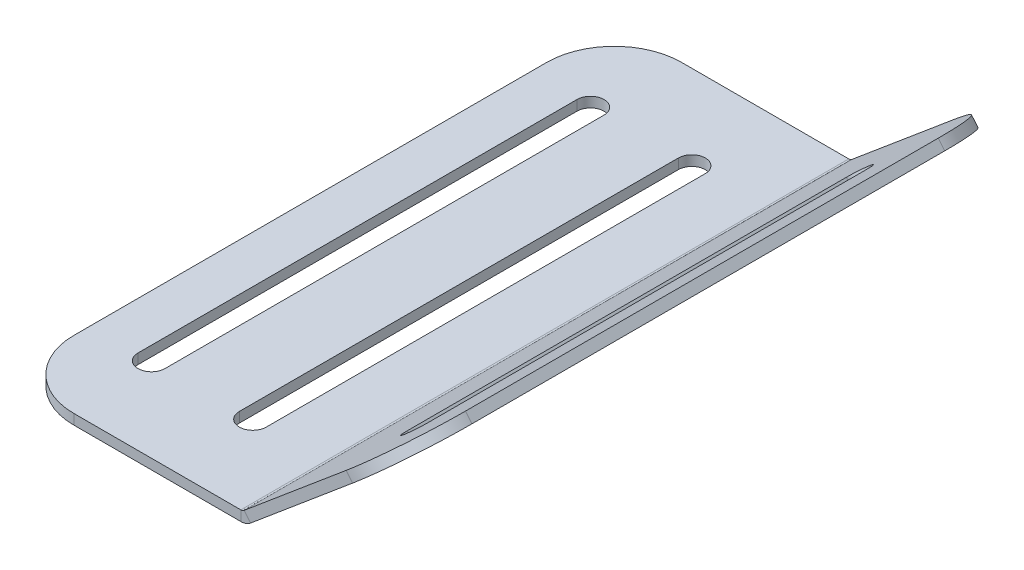
ISO-10303-21;
HEADER;
FILE_DESCRIPTION(('STEP AP214'),'2;1');
FILE_NAME('part.step','',(''),(''),'','','');
FILE_SCHEMA(('AUTOMOTIVE_DESIGN { 1 0 10303 214 1 1 1 1 }'));
ENDSEC;
DATA;
#1=APPLICATION_CONTEXT('core data for automotive mechanical design processes');
#2=APPLICATION_PROTOCOL_DEFINITION('international standard','automotive_design',2000,#1);
#3=PRODUCT_CONTEXT('',#1,'mechanical');
#4=PRODUCT('Part','Part','',(#3));
#5=PRODUCT_RELATED_PRODUCT_CATEGORY('part','',(#4));
#6=PRODUCT_DEFINITION_FORMATION('','',#4);
#7=PRODUCT_DEFINITION_CONTEXT('part definition',#1,'design');
#8=PRODUCT_DEFINITION('design','',#6,#7);
#9=PRODUCT_DEFINITION_SHAPE('','',#8);
#10=(LENGTH_UNIT() NAMED_UNIT(*) SI_UNIT(.MILLI.,.METRE.));
#11=(NAMED_UNIT(*) PLANE_ANGLE_UNIT() SI_UNIT($,.RADIAN.));
#12=(NAMED_UNIT(*) SI_UNIT($,.STERADIAN.) SOLID_ANGLE_UNIT());
#13=UNCERTAINTY_MEASURE_WITH_UNIT(LENGTH_MEASURE(1.E-05),#10,'distance_accuracy_value','');
#14=(GEOMETRIC_REPRESENTATION_CONTEXT(3) GLOBAL_UNCERTAINTY_ASSIGNED_CONTEXT((#13)) GLOBAL_UNIT_ASSIGNED_CONTEXT((#10,
#11,#12)) REPRESENTATION_CONTEXT('',''));
#15=CARTESIAN_POINT('',(0.,0.,0.));
#16=DIRECTION('',(0.,0.,1.));
#17=DIRECTION('',(1.,0.,0.));
#18=AXIS2_PLACEMENT_3D('',#15,#16,#17);
#19=CARTESIAN_POINT('',(35.2053768787346,0.17233166319856,90.));
#20=DIRECTION('',(0.,0.,1.));
#21=DIRECTION('',(1.,0.,0.));
#22=AXIS2_PLACEMENT_3D('',#19,#20,#21);
#23=PLANE('',#22);
#24=DIRECTION('',(0.642787609686539,-0.766044443118978,0.));
#25=VECTOR('',#24,1.);
#26=CARTESIAN_POINT('',(35.2053768787346,0.17233166319856,90.));
#27=LINE('',#26,#25);
#28=CARTESIAN_POINT('',(35.2053768787346,0.17233166319856,90.));
#29=VERTEX_POINT('',#28);
#30=CARTESIAN_POINT('',(36.1695582932644,-0.976735001479905,90.));
#31=VERTEX_POINT('',#30);
#32=EDGE_CURVE('E401',#29,#31,#27,.T.);
#33=ORIENTED_EDGE('',*,*,#32,.F.);
#34=CARTESIAN_POINT('',(34.7318995254395,0.7366,90.));
#35=DIRECTION('',(0.,0.,-1.));
#36=DIRECTION('',(-1.,0.,0.));
#37=AXIS2_PLACEMENT_3D('',#34,#35,#36);
#38=CIRCLE('',#37,0.7366);
#39=CARTESIAN_POINT('',(34.7318995254395,0.,90.));
#40=VERTEX_POINT('',#39);
#41=EDGE_CURVE('E326',#40,#29,#38,.F.);
#42=ORIENTED_EDGE('',*,*,#41,.F.);
#43=DIRECTION('',(0.,1.,0.));
#44=VECTOR('',#43,1.);
#45=CARTESIAN_POINT('',(34.7318995254395,-1.5,90.));
#46=LINE('',#45,#44);
#47=CARTESIAN_POINT('',(34.7318995254395,-1.5,90.));
#48=VERTEX_POINT('',#47);
#49=EDGE_CURVE('E397',#48,#40,#46,.T.);
#50=ORIENTED_EDGE('',*,*,#49,.F.);
#51=CARTESIAN_POINT('',(34.7318995254395,0.7366,90.));
#52=DIRECTION('',(0.,0.,1.));
#53=DIRECTION('',(1.,0.,0.));
#54=AXIS2_PLACEMENT_3D('',#51,#52,#53);
#55=CIRCLE('',#54,2.2366);
#56=EDGE_CURVE('E336',#48,#31,#55,.T.);
#57=ORIENTED_EDGE('',*,*,#56,.T.);
#58=EDGE_LOOP('',(#33,#42,#50,#57));
#59=FACE_BOUND('',#58,.T.);
#60=ADVANCED_FACE('F41',(#59),#23,.T.);
#61=CARTESIAN_POINT('',(34.7318995254395,-1.5,90.));
#62=DIRECTION('',(0.,0.,1.));
#63=DIRECTION('',(1.,0.,0.));
#64=AXIS2_PLACEMENT_3D('',#61,#62,#63);
#65=PLANE('',#64);
#66=DIRECTION('',(0.766044443118977,0.64278760968654,0.));
#67=VECTOR('',#66,1.);
#68=CARTESIAN_POINT('',(35.9641814145298,-1.14906666467847,90.));
#69=LINE('',#68,#67);
#70=CARTESIAN_POINT('',(51.2850702769094,11.7066855290523,90.));
#71=VERTEX_POINT('',#70);
#72=EDGE_CURVE('E317',#31,#71,#69,.T.);
#73=ORIENTED_EDGE('',*,*,#72,.T.);
#74=DIRECTION('',(0.642787609686543,-0.766044443118975,0.));
#75=VECTOR('',#74,1.);
#76=CARTESIAN_POINT('',(50.9487220192779,12.1075297734474,90.));
#77=LINE('',#76,#75);
#78=CARTESIAN_POINT('',(50.3208888623795,12.8557521937308,90.));
#79=VERTEX_POINT('',#78);
#80=EDGE_CURVE('E459',#71,#79,#77,.F.);
#81=ORIENTED_EDGE('',*,*,#80,.T.);
#82=DIRECTION('',(0.766044443118977,0.64278760968654,0.));
#83=VECTOR('',#82,1.);
#84=CARTESIAN_POINT('',(35.,0.,90.));
#85=LINE('',#84,#83);
#86=EDGE_CURVE('E321',#29,#79,#85,.T.);
#87=ORIENTED_EDGE('',*,*,#86,.F.);
#88=ORIENTED_EDGE('',*,*,#32,.T.);
#89=EDGE_LOOP('',(#73,#81,#87,#88));
#90=FACE_BOUND('',#89,.T.);
#91=ADVANCED_FACE('F516',(#90),#65,.T.);
#92=CARTESIAN_POINT('',(34.7318995254395,0.,0.));
#93=DIRECTION('',(0.,0.,-1.));
#94=DIRECTION('',(-1.,0.,0.));
#95=AXIS2_PLACEMENT_3D('',#92,#93,#94);
#96=PLANE('',#95);
#97=DIRECTION('',(0.,-1.,0.));
#98=VECTOR('',#97,1.);
#99=CARTESIAN_POINT('',(34.7318995254395,0.,0.));
#100=LINE('',#99,#98);
#101=CARTESIAN_POINT('',(34.7318995254395,0.,0.));
#102=VERTEX_POINT('',#101);
#103=CARTESIAN_POINT('',(34.7318995254395,-1.5,0.));
#104=VERTEX_POINT('',#103);
#105=EDGE_CURVE('E393',#102,#104,#100,.T.);
#106=ORIENTED_EDGE('',*,*,#105,.F.);
#107=CARTESIAN_POINT('',(34.7318995254395,0.7366,0.));
#108=DIRECTION('',(0.,0.,-1.));
#109=DIRECTION('',(-1.,0.,0.));
#110=AXIS2_PLACEMENT_3D('',#107,#108,#109);
#111=CIRCLE('',#110,0.7366);
#112=CARTESIAN_POINT('',(35.2053768787346,0.17233166319856,0.));
#113=VERTEX_POINT('',#112);
#114=EDGE_CURVE('E348',#102,#113,#111,.F.);
#115=ORIENTED_EDGE('',*,*,#114,.T.);
#116=DIRECTION('',(-0.642787609686539,0.766044443118978,0.));
#117=VECTOR('',#116,1.);
#118=CARTESIAN_POINT('',(36.1695582932644,-0.976735001479905,0.));
#119=LINE('',#118,#117);
#120=CARTESIAN_POINT('',(36.1695582932644,-0.976735001479905,0.));
#121=VERTEX_POINT('',#120);
#122=EDGE_CURVE('E390',#121,#113,#119,.T.);
#123=ORIENTED_EDGE('',*,*,#122,.F.);
#124=CARTESIAN_POINT('',(34.7318995254395,0.7366,0.));
#125=DIRECTION('',(0.,0.,1.));
#126=DIRECTION('',(1.,0.,0.));
#127=AXIS2_PLACEMENT_3D('',#124,#125,#126);
#128=CIRCLE('',#127,2.2366);
#129=EDGE_CURVE('E322',#104,#121,#128,.T.);
#130=ORIENTED_EDGE('',*,*,#129,.F.);
#131=EDGE_LOOP('',(#106,#115,#123,#130));
#132=FACE_BOUND('',#131,.T.);
#133=ADVANCED_FACE('F536',(#132),#96,.T.);
#134=CARTESIAN_POINT('',(36.1695582932644,-0.976735001479905,0.));
#135=DIRECTION('',(0.,0.,-1.));
#136=DIRECTION('',(-1.,0.,0.));
#137=AXIS2_PLACEMENT_3D('',#134,#135,#136);
#138=PLANE('',#137);
#139=DIRECTION('',(1.,0.,0.));
#140=VECTOR('',#139,1.);
#141=CARTESIAN_POINT('',(0.,-1.5,0.));
#142=LINE('',#141,#140);
#143=CARTESIAN_POINT('',(10.,-1.5,0.));
#144=VERTEX_POINT('',#143);
#145=EDGE_CURVE('E355',#144,#104,#142,.T.);
#146=ORIENTED_EDGE('',*,*,#145,.F.);
#147=DIRECTION('',(0.,1.,0.));
#148=VECTOR('',#147,1.);
#149=CARTESIAN_POINT('',(10.,-0.976735001479905,0.));
#150=LINE('',#149,#148);
#151=CARTESIAN_POINT('',(10.,0.,0.));
#152=VERTEX_POINT('',#151);
#153=EDGE_CURVE('E462',#144,#152,#150,.T.);
#154=ORIENTED_EDGE('',*,*,#153,.T.);
#155=DIRECTION('',(1.,0.,0.));
#156=VECTOR('',#155,1.);
#157=CARTESIAN_POINT('',(0.,0.,0.));
#158=LINE('',#157,#156);
#159=EDGE_CURVE('E352',#152,#102,#158,.T.);
#160=ORIENTED_EDGE('',*,*,#159,.T.);
#161=ORIENTED_EDGE('',*,*,#105,.T.);
#162=EDGE_LOOP('',(#146,#154,#160,#161));
#163=FACE_BOUND('',#162,.T.);
#164=ADVANCED_FACE('F490',(#163),#138,.T.);
#165=CARTESIAN_POINT('',(35.9641814145298,-1.14906666467847,90.));
#166=DIRECTION('',(-0.64278760968654,0.766044443118977,0.));
#167=DIRECTION('',(-0.766044443118977,-0.64278760968654,0.));
#168=AXIS2_PLACEMENT_3D('',#165,#166,#167);
#169=PLANE('',#168);
#170=DIRECTION('',(0.,0.,-1.));
#171=VECTOR('',#170,1.);
#172=CARTESIAN_POINT('',(50.9020480553499,11.3852917242091,90.));
#173=LINE('',#172,#171);
#174=CARTESIAN_POINT('',(50.9020480553499,11.3852917242091,77.5));
#175=VERTEX_POINT('',#174);
#176=CARTESIAN_POINT('',(50.9020480553499,11.3852917242091,12.5));
#177=VERTEX_POINT('',#176);
#178=EDGE_CURVE('E252',#175,#177,#173,.T.);
#179=ORIENTED_EDGE('',*,*,#178,.T.);
#180=CARTESIAN_POINT('',(49.3699591691119,10.099716504836,12.5));
#181=DIRECTION('',(-0.64278760968654,0.766044443118977,0.));
#182=DIRECTION('',(-0.766044443118977,-0.64278760968654,0.));
#183=AXIS2_PLACEMENT_3D('',#180,#181,#182);
#184=CIRCLE('',#183,1.99999999999999);
#185=CARTESIAN_POINT('',(47.837870282874,8.81414128546291,12.5));
#186=VERTEX_POINT('',#185);
#187=EDGE_CURVE('E256',#177,#186,#184,.T.);
#188=ORIENTED_EDGE('',*,*,#187,.T.);
#189=DIRECTION('',(0.,0.,1.));
#190=VECTOR('',#189,1.);
#191=CARTESIAN_POINT('',(47.837870282874,8.81414128546292,90.));
#192=LINE('',#191,#190);
#193=CARTESIAN_POINT('',(47.837870282874,8.81414128546292,77.5));
#194=VERTEX_POINT('',#193);
#195=EDGE_CURVE('E243',#186,#194,#192,.T.);
#196=ORIENTED_EDGE('',*,*,#195,.T.);
#197=CARTESIAN_POINT('',(49.3699591691119,10.099716504836,77.5));
#198=DIRECTION('',(-0.64278760968654,0.766044443118977,0.));
#199=DIRECTION('',(-0.766044443118977,-0.64278760968654,0.));
#200=AXIS2_PLACEMENT_3D('',#197,#198,#199);
#201=CIRCLE('',#200,2.);
#202=EDGE_CURVE('E212',#194,#175,#201,.T.);
#203=ORIENTED_EDGE('',*,*,#202,.T.);
#204=EDGE_LOOP('',(#179,#188,#196,#203));
#205=FACE_BOUND('',#204,.T.);
#206=DIRECTION('',(0.766044443118977,0.64278760968654,0.));
#207=VECTOR('',#206,1.);
#208=CARTESIAN_POINT('',(35.9641814145298,-1.14906666467847,0.));
#209=LINE('',#208,#207);
#210=CARTESIAN_POINT('',(51.2850702769094,11.7066855290523,0.));
#211=VERTEX_POINT('',#210);
#212=EDGE_CURVE('E281',#121,#211,#209,.T.);
#213=ORIENTED_EDGE('',*,*,#212,.T.);
#214=CARTESIAN_POINT('',(51.2850702769094,11.7066855290523,10.));
#215=DIRECTION('',(-0.64278760968654,0.766044443118977,0.));
#216=DIRECTION('',(-0.766044443118977,-0.64278760968654,0.));
#217=AXIS2_PLACEMENT_3D('',#214,#215,#216);
#218=CIRCLE('',#217,10.);
#219=CARTESIAN_POINT('',(58.9455147080991,18.1345616259177,10.));
#220=VERTEX_POINT('',#219);
#221=EDGE_CURVE('E443',#211,#220,#218,.F.);
#222=ORIENTED_EDGE('',*,*,#221,.T.);
#223=DIRECTION('',(0.,0.,-1.));
#224=VECTOR('',#223,1.);
#225=CARTESIAN_POINT('',(58.9455147080991,18.1345616259177,90.));
#226=LINE('',#225,#224);
#227=CARTESIAN_POINT('',(58.9455147080991,18.1345616259177,80.));
#228=VERTEX_POINT('',#227);
#229=EDGE_CURVE('E386',#228,#220,#226,.T.);
#230=ORIENTED_EDGE('',*,*,#229,.F.);
#231=CARTESIAN_POINT('',(51.2850702769094,11.7066855290523,80.));
#232=DIRECTION('',(-0.64278760968654,0.766044443118977,0.));
#233=DIRECTION('',(-0.766044443118977,-0.64278760968654,0.));
#234=AXIS2_PLACEMENT_3D('',#231,#232,#233);
#235=CIRCLE('',#234,10.);
#236=EDGE_CURVE('E440',#228,#71,#235,.F.);
#237=ORIENTED_EDGE('',*,*,#236,.T.);
#238=ORIENTED_EDGE('',*,*,#72,.F.);
#239=DIRECTION('',(0.,0.,-1.));
#240=VECTOR('',#239,1.);
#241=CARTESIAN_POINT('',(36.1695582932644,-0.976735001479905,90.));
#242=LINE('',#241,#240);
#243=EDGE_CURVE('E340',#31,#121,#242,.T.);
#244=ORIENTED_EDGE('',*,*,#243,.T.);
#245=EDGE_LOOP('',(#213,#222,#230,#237,#238,#244));
#246=FACE_BOUND('',#245,.T.);
#247=ADVANCED_FACE('F540',(#205,#246),#169,.F.);
#248=CARTESIAN_POINT('',(57.9813332935693,19.2836282905962,90.));
#249=DIRECTION('',(0.766044443118975,0.642787609686543,0.));
#250=DIRECTION('',(-0.642787609686543,0.766044443118975,0.));
#251=AXIS2_PLACEMENT_3D('',#248,#249,#250);
#252=PLANE('',#251);
#253=ORIENTED_EDGE('',*,*,#229,.T.);
#254=DIRECTION('',(0.642787609686543,-0.766044443118975,0.));
#255=VECTOR('',#254,1.);
#256=CARTESIAN_POINT('',(57.9813332935693,19.2836282905962,9.99999999999999));
#257=LINE('',#256,#255);
#258=CARTESIAN_POINT('',(57.9813332935693,19.2836282905962,10.));
#259=VERTEX_POINT('',#258);
#260=EDGE_CURVE('E450',#220,#259,#257,.F.);
#261=ORIENTED_EDGE('',*,*,#260,.T.);
#262=DIRECTION('',(0.,0.,-1.));
#263=VECTOR('',#262,1.);
#264=CARTESIAN_POINT('',(57.9813332935693,19.2836282905962,90.));
#265=LINE('',#264,#263);
#266=CARTESIAN_POINT('',(57.9813332935693,19.2836282905962,80.));
#267=VERTEX_POINT('',#266);
#268=EDGE_CURVE('E382',#267,#259,#265,.T.);
#269=ORIENTED_EDGE('',*,*,#268,.F.);
#270=DIRECTION('',(0.642787609686543,-0.766044443118975,0.));
#271=VECTOR('',#270,1.);
#272=CARTESIAN_POINT('',(57.9813332935693,19.2836282905962,80.));
#273=LINE('',#272,#271);
#274=EDGE_CURVE('E446',#267,#228,#273,.T.);
#275=ORIENTED_EDGE('',*,*,#274,.T.);
#276=EDGE_LOOP('',(#253,#261,#269,#275));
#277=FACE_BOUND('',#276,.T.);
#278=ADVANCED_FACE('F525',(#277),#252,.T.);
#279=CARTESIAN_POINT('',(35.,0.,90.));
#280=DIRECTION('',(-0.64278760968654,0.766044443118977,0.));
#281=DIRECTION('',(-0.766044443118977,-0.64278760968654,0.));
#282=AXIS2_PLACEMENT_3D('',#279,#280,#281);
#283=PLANE('',#282);
#284=CARTESIAN_POINT('',(48.4057777545821,11.2487831695145,12.5));
#285=DIRECTION('',(-0.64278760968654,0.766044443118977,0.));
#286=DIRECTION('',(-0.766044443118977,-0.64278760968654,0.));
#287=AXIS2_PLACEMENT_3D('',#284,#285,#286);
#288=CIRCLE('',#287,1.99999999999999);
#289=CARTESIAN_POINT('',(49.93786664082,12.5343583888875,12.5));
#290=VERTEX_POINT('',#289);
#291=CARTESIAN_POINT('',(46.8736888683442,9.96320795014138,12.5));
#292=VERTEX_POINT('',#291);
#293=EDGE_CURVE('E227',#290,#292,#288,.T.);
#294=ORIENTED_EDGE('',*,*,#293,.F.);
#295=DIRECTION('',(0.,0.,-1.));
#296=VECTOR('',#295,1.);
#297=CARTESIAN_POINT('',(49.93786664082,12.5343583888875,12.5));
#298=LINE('',#297,#296);
#299=CARTESIAN_POINT('',(49.9378666408201,12.5343583888875,77.5));
#300=VERTEX_POINT('',#299);
#301=EDGE_CURVE('E232',#300,#290,#298,.T.);
#302=ORIENTED_EDGE('',*,*,#301,.F.);
#303=CARTESIAN_POINT('',(48.4057777545821,11.2487831695145,77.5));
#304=DIRECTION('',(-0.64278760968654,0.766044443118977,0.));
#305=DIRECTION('',(-0.766044443118977,-0.64278760968654,0.));
#306=AXIS2_PLACEMENT_3D('',#303,#304,#305);
#307=CIRCLE('',#306,2.);
#308=CARTESIAN_POINT('',(46.8736888683442,9.96320795014138,77.5));
#309=VERTEX_POINT('',#308);
#310=EDGE_CURVE('E209',#309,#300,#307,.T.);
#311=ORIENTED_EDGE('',*,*,#310,.F.);
#312=DIRECTION('',(0.,0.,1.));
#313=VECTOR('',#312,1.);
#314=CARTESIAN_POINT('',(46.8736888683442,9.96320795014138,12.5));
#315=LINE('',#314,#313);
#316=EDGE_CURVE('E221',#292,#309,#315,.T.);
#317=ORIENTED_EDGE('',*,*,#316,.F.);
#318=EDGE_LOOP('',(#294,#302,#311,#317));
#319=FACE_BOUND('',#318,.T.);
#320=ORIENTED_EDGE('',*,*,#268,.T.);
#321=CARTESIAN_POINT('',(50.3208888623795,12.8557521937308,10.));
#322=DIRECTION('',(-0.64278760968654,0.766044443118977,0.));
#323=DIRECTION('',(-0.766044443118977,-0.64278760968654,0.));
#324=AXIS2_PLACEMENT_3D('',#321,#322,#323);
#325=CIRCLE('',#324,10.);
#326=CARTESIAN_POINT('',(50.3208888623795,12.8557521937308,0.));
#327=VERTEX_POINT('',#326);
#328=EDGE_CURVE('E456',#259,#327,#325,.T.);
#329=ORIENTED_EDGE('',*,*,#328,.T.);
#330=DIRECTION('',(0.766044443118977,0.64278760968654,0.));
#331=VECTOR('',#330,1.);
#332=CARTESIAN_POINT('',(35.,0.,0.));
#333=LINE('',#332,#331);
#334=EDGE_CURVE('E344',#113,#327,#333,.T.);
#335=ORIENTED_EDGE('',*,*,#334,.F.);
#336=DIRECTION('',(0.,0.,-1.));
#337=VECTOR('',#336,1.);
#338=CARTESIAN_POINT('',(35.2053768787346,0.17233166319856,90.));
#339=LINE('',#338,#337);
#340=EDGE_CURVE('E378',#29,#113,#339,.T.);
#341=ORIENTED_EDGE('',*,*,#340,.F.);
#342=ORIENTED_EDGE('',*,*,#86,.T.);
#343=CARTESIAN_POINT('',(50.3208888623795,12.8557521937308,80.));
#344=DIRECTION('',(-0.64278760968654,0.766044443118977,0.));
#345=DIRECTION('',(-0.766044443118977,-0.64278760968654,0.));
#346=AXIS2_PLACEMENT_3D('',#343,#344,#345);
#347=CIRCLE('',#346,10.);
#348=EDGE_CURVE('E453',#79,#267,#347,.T.);
#349=ORIENTED_EDGE('',*,*,#348,.T.);
#350=EDGE_LOOP('',(#320,#329,#335,#341,#342,#349));
#351=FACE_BOUND('',#350,.T.);
#352=ADVANCED_FACE('F229',(#319,#351),#283,.T.);
#353=CARTESIAN_POINT('',(34.7318995254395,0.7366,90.));
#354=DIRECTION('',(0.,0.,-1.));
#355=DIRECTION('',(-1.,0.,0.));
#356=AXIS2_PLACEMENT_3D('',#353,#354,#355);
#357=CYLINDRICAL_SURFACE('',#356,0.7366);
#358=ORIENTED_EDGE('',*,*,#114,.F.);
#359=DIRECTION('',(0.,0.,-1.));
#360=VECTOR('',#359,1.);
#361=CARTESIAN_POINT('',(34.7318995254395,0.,90.));
#362=LINE('',#361,#360);
#363=EDGE_CURVE('E374',#40,#102,#362,.T.);
#364=ORIENTED_EDGE('',*,*,#363,.F.);
#365=ORIENTED_EDGE('',*,*,#41,.T.);
#366=ORIENTED_EDGE('',*,*,#340,.T.);
#367=EDGE_LOOP('',(#358,#364,#365,#366));
#368=FACE_BOUND('',#367,.T.);
#369=ADVANCED_FACE('F508',(#368),#357,.F.);
#370=CARTESIAN_POINT('',(0.,0.,90.));
#371=DIRECTION('',(0.,1.,0.));
#372=DIRECTION('',(0.,0.,1.));
#373=AXIS2_PLACEMENT_3D('',#370,#371,#372);
#374=PLANE('',#373);
#375=CARTESIAN_POINT('',(8.99999999999999,0.,12.5));
#376=DIRECTION('',(0.,1.,0.));
#377=DIRECTION('',(0.,0.,1.));
#378=AXIS2_PLACEMENT_3D('',#375,#376,#377);
#379=CIRCLE('',#378,2.);
#380=CARTESIAN_POINT('',(11.,0.,12.5));
#381=VERTEX_POINT('',#380);
#382=CARTESIAN_POINT('',(6.99999999999999,0.,12.5));
#383=VERTEX_POINT('',#382);
#384=EDGE_CURVE('E261',#381,#383,#379,.T.);
#385=ORIENTED_EDGE('',*,*,#384,.F.);
#386=DIRECTION('',(0.,0.,-1.));
#387=VECTOR('',#386,1.);
#388=CARTESIAN_POINT('',(11.,0.,12.5));
#389=LINE('',#388,#387);
#390=CARTESIAN_POINT('',(11.,0.,77.5));
#391=VERTEX_POINT('',#390);
#392=EDGE_CURVE('E273',#391,#381,#389,.T.);
#393=ORIENTED_EDGE('',*,*,#392,.F.);
#394=CARTESIAN_POINT('',(9.00000000000001,0.,77.5));
#395=DIRECTION('',(0.,1.,0.));
#396=DIRECTION('',(0.,0.,1.));
#397=AXIS2_PLACEMENT_3D('',#394,#395,#396);
#398=CIRCLE('',#397,2.);
#399=CARTESIAN_POINT('',(7.00000000000001,0.,77.5));
#400=VERTEX_POINT('',#399);
#401=EDGE_CURVE('E269',#400,#391,#398,.T.);
#402=ORIENTED_EDGE('',*,*,#401,.F.);
#403=DIRECTION('',(0.,0.,1.));
#404=VECTOR('',#403,1.);
#405=CARTESIAN_POINT('',(6.99999999999999,0.,12.5));
#406=LINE('',#405,#404);
#407=EDGE_CURVE('E264',#383,#400,#406,.T.);
#408=ORIENTED_EDGE('',*,*,#407,.F.);
#409=EDGE_LOOP('',(#385,#393,#402,#408));
#410=FACE_BOUND('',#409,.T.);
#411=CARTESIAN_POINT('',(24.,0.,12.5));
#412=DIRECTION('',(0.,1.,0.));
#413=DIRECTION('',(0.,0.,1.));
#414=AXIS2_PLACEMENT_3D('',#411,#412,#413);
#415=CIRCLE('',#414,1.99999999999999);
#416=CARTESIAN_POINT('',(26.,0.,12.5));
#417=VERTEX_POINT('',#416);
#418=CARTESIAN_POINT('',(22.,0.,12.5));
#419=VERTEX_POINT('',#418);
#420=EDGE_CURVE('E260',#417,#419,#415,.T.);
#421=ORIENTED_EDGE('',*,*,#420,.F.);
#422=DIRECTION('',(0.,0.,-1.));
#423=VECTOR('',#422,1.);
#424=CARTESIAN_POINT('',(26.,0.,12.5));
#425=LINE('',#424,#423);
#426=CARTESIAN_POINT('',(26.,0.,77.5));
#427=VERTEX_POINT('',#426);
#428=EDGE_CURVE('E301',#427,#417,#425,.T.);
#429=ORIENTED_EDGE('',*,*,#428,.F.);
#430=CARTESIAN_POINT('',(24.,0.,77.5));
#431=DIRECTION('',(0.,1.,0.));
#432=DIRECTION('',(0.,0.,1.));
#433=AXIS2_PLACEMENT_3D('',#430,#431,#432);
#434=CIRCLE('',#433,2.);
#435=CARTESIAN_POINT('',(22.,0.,77.5));
#436=VERTEX_POINT('',#435);
#437=EDGE_CURVE('E297',#436,#427,#434,.T.);
#438=ORIENTED_EDGE('',*,*,#437,.F.);
#439=DIRECTION('',(0.,0.,1.));
#440=VECTOR('',#439,1.);
#441=CARTESIAN_POINT('',(22.,0.,12.5));
#442=LINE('',#441,#440);
#443=EDGE_CURVE('E293',#419,#436,#442,.T.);
#444=ORIENTED_EDGE('',*,*,#443,.F.);
#445=EDGE_LOOP('',(#421,#429,#438,#444));
#446=FACE_BOUND('',#445,.T.);
#447=ORIENTED_EDGE('',*,*,#159,.F.);
#448=CARTESIAN_POINT('',(10.,0.,10.));
#449=DIRECTION('',(0.,1.,0.));
#450=DIRECTION('',(0.,0.,1.));
#451=AXIS2_PLACEMENT_3D('',#448,#449,#450);
#452=CIRCLE('',#451,10.);
#453=CARTESIAN_POINT('',(0.,0.,10.));
#454=VERTEX_POINT('',#453);
#455=EDGE_CURVE('E469',#152,#454,#452,.T.);
#456=ORIENTED_EDGE('',*,*,#455,.T.);
#457=DIRECTION('',(0.,0.,-1.));
#458=VECTOR('',#457,1.);
#459=CARTESIAN_POINT('',(0.,0.,90.));
#460=LINE('',#459,#458);
#461=CARTESIAN_POINT('',(0.,0.,80.));
#462=VERTEX_POINT('',#461);
#463=EDGE_CURVE('E371',#462,#454,#460,.T.);
#464=ORIENTED_EDGE('',*,*,#463,.F.);
#465=CARTESIAN_POINT('',(10.,0.,80.));
#466=DIRECTION('',(0.,1.,0.));
#467=DIRECTION('',(0.,0.,1.));
#468=AXIS2_PLACEMENT_3D('',#465,#466,#467);
#469=CIRCLE('',#468,10.);
#470=CARTESIAN_POINT('',(10.,0.,90.));
#471=VERTEX_POINT('',#470);
#472=EDGE_CURVE('E466',#462,#471,#469,.T.);
#473=ORIENTED_EDGE('',*,*,#472,.T.);
#474=DIRECTION('',(1.,0.,0.));
#475=VECTOR('',#474,1.);
#476=CARTESIAN_POINT('',(0.,0.,90.));
#477=LINE('',#476,#475);
#478=EDGE_CURVE('E330',#471,#40,#477,.T.);
#479=ORIENTED_EDGE('',*,*,#478,.T.);
#480=ORIENTED_EDGE('',*,*,#363,.T.);
#481=EDGE_LOOP('',(#447,#456,#464,#473,#479,#480));
#482=FACE_BOUND('',#481,.T.);
#483=ADVANCED_FACE('F496',(#410,#446,#482),#374,.T.);
#484=CARTESIAN_POINT('',(0.,-1.5,90.));
#485=DIRECTION('',(-1.,0.,0.));
#486=DIRECTION('',(0.,0.,1.));
#487=AXIS2_PLACEMENT_3D('',#484,#485,#486);
#488=PLANE('',#487);
#489=ORIENTED_EDGE('',*,*,#463,.T.);
#490=DIRECTION('',(0.,1.,0.));
#491=VECTOR('',#490,1.);
#492=CARTESIAN_POINT('',(0.,-1.5,9.99999999999999));
#493=LINE('',#492,#491);
#494=CARTESIAN_POINT('',(0.,-1.5,10.));
#495=VERTEX_POINT('',#494);
#496=EDGE_CURVE('E63',#454,#495,#493,.F.);
#497=ORIENTED_EDGE('',*,*,#496,.T.);
#498=DIRECTION('',(0.,0.,-1.));
#499=VECTOR('',#498,1.);
#500=CARTESIAN_POINT('',(0.,-1.5,90.));
#501=LINE('',#500,#499);
#502=CARTESIAN_POINT('',(0.,-1.5,80.));
#503=VERTEX_POINT('',#502);
#504=EDGE_CURVE('E368',#503,#495,#501,.T.);
#505=ORIENTED_EDGE('',*,*,#504,.F.);
#506=DIRECTION('',(0.,1.,0.));
#507=VECTOR('',#506,1.);
#508=CARTESIAN_POINT('',(0.,0.,80.));
#509=LINE('',#508,#507);
#510=EDGE_CURVE('E472',#503,#462,#509,.T.);
#511=ORIENTED_EDGE('',*,*,#510,.T.);
#512=EDGE_LOOP('',(#489,#497,#505,#511));
#513=FACE_BOUND('',#512,.T.);
#514=ADVANCED_FACE('F497',(#513),#488,.T.);
#515=CARTESIAN_POINT('',(0.,-1.5,90.));
#516=DIRECTION('',(0.,1.,0.));
#517=DIRECTION('',(0.,0.,1.));
#518=AXIS2_PLACEMENT_3D('',#515,#516,#517);
#519=PLANE('',#518);
#520=DIRECTION('',(0.,0.,-1.));
#521=VECTOR('',#520,1.);
#522=CARTESIAN_POINT('',(11.,-1.5,90.));
#523=LINE('',#522,#521);
#524=CARTESIAN_POINT('',(11.,-1.5,77.5));
#525=VERTEX_POINT('',#524);
#526=CARTESIAN_POINT('',(11.,-1.5,12.5));
#527=VERTEX_POINT('',#526);
#528=EDGE_CURVE('E428',#525,#527,#523,.T.);
#529=ORIENTED_EDGE('',*,*,#528,.T.);
#530=CARTESIAN_POINT('',(8.99999999999999,-1.5,12.5));
#531=DIRECTION('',(0.,1.,0.));
#532=DIRECTION('',(0.,0.,1.));
#533=AXIS2_PLACEMENT_3D('',#530,#531,#532);
#534=CIRCLE('',#533,2.);
#535=CARTESIAN_POINT('',(6.99999999999999,-1.5,12.5));
#536=VERTEX_POINT('',#535);
#537=EDGE_CURVE('E432',#527,#536,#534,.T.);
#538=ORIENTED_EDGE('',*,*,#537,.T.);
#539=DIRECTION('',(0.,0.,1.));
#540=VECTOR('',#539,1.);
#541=CARTESIAN_POINT('',(7.00000000000001,-1.5,90.));
#542=LINE('',#541,#540);
#543=CARTESIAN_POINT('',(7.00000000000001,-1.5,77.5));
#544=VERTEX_POINT('',#543);
#545=EDGE_CURVE('E420',#536,#544,#542,.T.);
#546=ORIENTED_EDGE('',*,*,#545,.T.);
#547=CARTESIAN_POINT('',(9.00000000000001,-1.5,77.5));
#548=DIRECTION('',(0.,1.,0.));
#549=DIRECTION('',(0.,0.,1.));
#550=AXIS2_PLACEMENT_3D('',#547,#548,#549);
#551=CIRCLE('',#550,2.);
#552=EDGE_CURVE('E424',#544,#525,#551,.T.);
#553=ORIENTED_EDGE('',*,*,#552,.T.);
#554=EDGE_LOOP('',(#529,#538,#546,#553));
#555=FACE_BOUND('',#554,.T.);
#556=DIRECTION('',(0.,0.,-1.));
#557=VECTOR('',#556,1.);
#558=CARTESIAN_POINT('',(26.,-1.5,90.));
#559=LINE('',#558,#557);
#560=CARTESIAN_POINT('',(26.,-1.5,77.5));
#561=VERTEX_POINT('',#560);
#562=CARTESIAN_POINT('',(26.,-1.5,12.5));
#563=VERTEX_POINT('',#562);
#564=EDGE_CURVE('E412',#561,#563,#559,.T.);
#565=ORIENTED_EDGE('',*,*,#564,.T.);
#566=CARTESIAN_POINT('',(24.,-1.5,12.5));
#567=DIRECTION('',(0.,1.,0.));
#568=DIRECTION('',(0.,0.,1.));
#569=AXIS2_PLACEMENT_3D('',#566,#567,#568);
#570=CIRCLE('',#569,1.99999999999999);
#571=CARTESIAN_POINT('',(22.,-1.5,12.5));
#572=VERTEX_POINT('',#571);
#573=EDGE_CURVE('E416',#563,#572,#570,.T.);
#574=ORIENTED_EDGE('',*,*,#573,.T.);
#575=DIRECTION('',(0.,0.,1.));
#576=VECTOR('',#575,1.);
#577=CARTESIAN_POINT('',(22.,-1.5,90.));
#578=LINE('',#577,#576);
#579=CARTESIAN_POINT('',(22.,-1.5,77.5));
#580=VERTEX_POINT('',#579);
#581=EDGE_CURVE('E404',#572,#580,#578,.T.);
#582=ORIENTED_EDGE('',*,*,#581,.T.);
#583=CARTESIAN_POINT('',(24.,-1.5,77.5));
#584=DIRECTION('',(0.,1.,0.));
#585=DIRECTION('',(0.,0.,1.));
#586=AXIS2_PLACEMENT_3D('',#583,#584,#585);
#587=CIRCLE('',#586,2.);
#588=EDGE_CURVE('E408',#580,#561,#587,.T.);
#589=ORIENTED_EDGE('',*,*,#588,.T.);
#590=EDGE_LOOP('',(#565,#574,#582,#589));
#591=FACE_BOUND('',#590,.T.);
#592=ORIENTED_EDGE('',*,*,#504,.T.);
#593=CARTESIAN_POINT('',(10.,-1.5,10.));
#594=DIRECTION('',(0.,1.,0.));
#595=DIRECTION('',(0.,0.,1.));
#596=AXIS2_PLACEMENT_3D('',#593,#594,#595);
#597=CIRCLE('',#596,10.);
#598=EDGE_CURVE('E50',#495,#144,#597,.F.);
#599=ORIENTED_EDGE('',*,*,#598,.T.);
#600=ORIENTED_EDGE('',*,*,#145,.T.);
#601=DIRECTION('',(0.,0.,-1.));
#602=VECTOR('',#601,1.);
#603=CARTESIAN_POINT('',(34.7318995254395,-1.5,90.));
#604=LINE('',#603,#602);
#605=EDGE_CURVE('E364',#48,#104,#604,.T.);
#606=ORIENTED_EDGE('',*,*,#605,.F.);
#607=DIRECTION('',(1.,0.,0.));
#608=VECTOR('',#607,1.);
#609=CARTESIAN_POINT('',(0.,-1.5,90.));
#610=LINE('',#609,#608);
#611=CARTESIAN_POINT('',(10.,-1.5,90.));
#612=VERTEX_POINT('',#611);
#613=EDGE_CURVE('E333',#612,#48,#610,.T.);
#614=ORIENTED_EDGE('',*,*,#613,.F.);
#615=CARTESIAN_POINT('',(10.,-1.5,80.));
#616=DIRECTION('',(0.,1.,0.));
#617=DIRECTION('',(0.,0.,1.));
#618=AXIS2_PLACEMENT_3D('',#615,#616,#617);
#619=CIRCLE('',#618,10.);
#620=EDGE_CURVE('E478',#612,#503,#619,.F.);
#621=ORIENTED_EDGE('',*,*,#620,.T.);
#622=EDGE_LOOP('',(#592,#599,#600,#606,#614,#621));
#623=FACE_BOUND('',#622,.T.);
#624=ADVANCED_FACE('F485',(#555,#591,#623),#519,.F.);
#625=CARTESIAN_POINT('',(34.7318995254395,0.7366,90.));
#626=DIRECTION('',(0.,0.,-1.));
#627=DIRECTION('',(-1.,0.,0.));
#628=AXIS2_PLACEMENT_3D('',#625,#626,#627);
#629=CYLINDRICAL_SURFACE('',#628,2.2366);
#630=ORIENTED_EDGE('',*,*,#129,.T.);
#631=ORIENTED_EDGE('',*,*,#243,.F.);
#632=ORIENTED_EDGE('',*,*,#56,.F.);
#633=ORIENTED_EDGE('',*,*,#605,.T.);
#634=EDGE_LOOP('',(#630,#631,#632,#633));
#635=FACE_BOUND('',#634,.T.);
#636=ADVANCED_FACE('F538',(#635),#629,.T.);
#637=CARTESIAN_POINT('',(34.7318995254395,0.7366,90.));
#638=DIRECTION('',(0.,0.,-1.));
#639=DIRECTION('',(-1.,0.,0.));
#640=AXIS2_PLACEMENT_3D('',#637,#638,#639);
#641=PLANE('',#640);
#642=ORIENTED_EDGE('',*,*,#478,.F.);
#643=DIRECTION('',(0.,1.,0.));
#644=VECTOR('',#643,1.);
#645=CARTESIAN_POINT('',(10.,-1.5,90.));
#646=LINE('',#645,#644);
#647=EDGE_CURVE('E11',#471,#612,#646,.F.);
#648=ORIENTED_EDGE('',*,*,#647,.T.);
#649=ORIENTED_EDGE('',*,*,#613,.T.);
#650=ORIENTED_EDGE('',*,*,#49,.T.);
#651=EDGE_LOOP('',(#642,#648,#649,#650));
#652=FACE_BOUND('',#651,.T.);
#653=ADVANCED_FACE('F501',(#652),#641,.F.);
#654=CARTESIAN_POINT('',(34.7318995254395,0.7366,0.));
#655=DIRECTION('',(0.,0.,-1.));
#656=DIRECTION('',(-1.,0.,0.));
#657=AXIS2_PLACEMENT_3D('',#654,#655,#656);
#658=PLANE('',#657);
#659=ORIENTED_EDGE('',*,*,#334,.T.);
#660=DIRECTION('',(0.642787609686543,-0.766044443118975,0.));
#661=VECTOR('',#660,1.);
#662=CARTESIAN_POINT('',(49.8474115090844,13.4200205305323,0.));
#663=LINE('',#662,#661);
#664=EDGE_CURVE('E436',#327,#211,#663,.T.);
#665=ORIENTED_EDGE('',*,*,#664,.T.);
#666=ORIENTED_EDGE('',*,*,#212,.F.);
#667=ORIENTED_EDGE('',*,*,#122,.T.);
#668=EDGE_LOOP('',(#659,#665,#666,#667));
#669=FACE_BOUND('',#668,.T.);
#670=ADVANCED_FACE('F532',(#669),#658,.T.);
#671=CARTESIAN_POINT('',(24.,-10.,12.5));
#672=DIRECTION('',(0.,1.,0.));
#673=DIRECTION('',(0.,0.,1.));
#674=AXIS2_PLACEMENT_3D('',#671,#672,#673);
#675=CYLINDRICAL_SURFACE('',#674,1.99999999999999);
#676=DIRECTION('',(0.,1.,0.));
#677=VECTOR('',#676,1.);
#678=CARTESIAN_POINT('',(26.,-10.,12.5));
#679=LINE('',#678,#677);
#680=EDGE_CURVE('E265',#563,#417,#679,.T.);
#681=ORIENTED_EDGE('',*,*,#680,.T.);
#682=ORIENTED_EDGE('',*,*,#420,.T.);
#683=DIRECTION('',(0.,1.,0.));
#684=VECTOR('',#683,1.);
#685=CARTESIAN_POINT('',(22.,-10.,12.5));
#686=LINE('',#685,#684);
#687=EDGE_CURVE('E305',#572,#419,#686,.T.);
#688=ORIENTED_EDGE('',*,*,#687,.F.);
#689=ORIENTED_EDGE('',*,*,#573,.F.);
#690=EDGE_LOOP('',(#681,#682,#688,#689));
#691=FACE_BOUND('',#690,.T.);
#692=ADVANCED_FACE('F691',(#691),#675,.F.);
#693=CARTESIAN_POINT('',(26.,-10.,12.5));
#694=DIRECTION('',(1.,0.,0.));
#695=DIRECTION('',(0.,0.,-1.));
#696=AXIS2_PLACEMENT_3D('',#693,#694,#695);
#697=PLANE('',#696);
#698=DIRECTION('',(0.,1.,0.));
#699=VECTOR('',#698,1.);
#700=CARTESIAN_POINT('',(26.,-10.,77.5));
#701=LINE('',#700,#699);
#702=EDGE_CURVE('E308',#561,#427,#701,.T.);
#703=ORIENTED_EDGE('',*,*,#702,.T.);
#704=ORIENTED_EDGE('',*,*,#428,.T.);
#705=ORIENTED_EDGE('',*,*,#680,.F.);
#706=ORIENTED_EDGE('',*,*,#564,.F.);
#707=EDGE_LOOP('',(#703,#704,#705,#706));
#708=FACE_BOUND('',#707,.T.);
#709=ADVANCED_FACE('F681',(#708),#697,.F.);
#710=CARTESIAN_POINT('',(24.,-10.,77.5));
#711=DIRECTION('',(0.,1.,0.));
#712=DIRECTION('',(0.,0.,1.));
#713=AXIS2_PLACEMENT_3D('',#710,#711,#712);
#714=CYLINDRICAL_SURFACE('',#713,2.);
#715=DIRECTION('',(0.,1.,0.));
#716=VECTOR('',#715,1.);
#717=CARTESIAN_POINT('',(22.,-10.,77.5));
#718=LINE('',#717,#716);
#719=EDGE_CURVE('E311',#580,#436,#718,.T.);
#720=ORIENTED_EDGE('',*,*,#719,.T.);
#721=ORIENTED_EDGE('',*,*,#437,.T.);
#722=ORIENTED_EDGE('',*,*,#702,.F.);
#723=ORIENTED_EDGE('',*,*,#588,.F.);
#724=EDGE_LOOP('',(#720,#721,#722,#723));
#725=FACE_BOUND('',#724,.T.);
#726=ADVANCED_FACE('F671',(#725),#714,.F.);
#727=CARTESIAN_POINT('',(22.,-10.,12.5));
#728=DIRECTION('',(-1.,0.,0.));
#729=DIRECTION('',(0.,0.,1.));
#730=AXIS2_PLACEMENT_3D('',#727,#728,#729);
#731=PLANE('',#730);
#732=ORIENTED_EDGE('',*,*,#687,.T.);
#733=ORIENTED_EDGE('',*,*,#443,.T.);
#734=ORIENTED_EDGE('',*,*,#719,.F.);
#735=ORIENTED_EDGE('',*,*,#581,.F.);
#736=EDGE_LOOP('',(#732,#733,#734,#735));
#737=FACE_BOUND('',#736,.T.);
#738=ADVANCED_FACE('F661',(#737),#731,.F.);
#739=CARTESIAN_POINT('',(8.99999999999999,-10.,12.5));
#740=DIRECTION('',(0.,1.,0.));
#741=DIRECTION('',(0.,0.,1.));
#742=AXIS2_PLACEMENT_3D('',#739,#740,#741);
#743=CYLINDRICAL_SURFACE('',#742,2.);
#744=DIRECTION('',(0.,1.,0.));
#745=VECTOR('',#744,1.);
#746=CARTESIAN_POINT('',(11.,-10.,12.5));
#747=LINE('',#746,#745);
#748=EDGE_CURVE('E278',#527,#381,#747,.T.);
#749=ORIENTED_EDGE('',*,*,#748,.T.);
#750=ORIENTED_EDGE('',*,*,#384,.T.);
#751=DIRECTION('',(0.,1.,0.));
#752=VECTOR('',#751,1.);
#753=CARTESIAN_POINT('',(6.99999999999999,-10.,12.5));
#754=LINE('',#753,#752);
#755=EDGE_CURVE('E277',#536,#383,#754,.T.);
#756=ORIENTED_EDGE('',*,*,#755,.F.);
#757=ORIENTED_EDGE('',*,*,#537,.F.);
#758=EDGE_LOOP('',(#749,#750,#756,#757));
#759=FACE_BOUND('',#758,.T.);
#760=ADVANCED_FACE('F651',(#759),#743,.F.);
#761=CARTESIAN_POINT('',(11.,-10.,12.5));
#762=DIRECTION('',(1.,0.,0.));
#763=DIRECTION('',(0.,0.,-1.));
#764=AXIS2_PLACEMENT_3D('',#761,#762,#763);
#765=PLANE('',#764);
#766=DIRECTION('',(0.,1.,0.));
#767=VECTOR('',#766,1.);
#768=CARTESIAN_POINT('',(11.,-10.,77.5));
#769=LINE('',#768,#767);
#770=EDGE_CURVE('E282',#525,#391,#769,.T.);
#771=ORIENTED_EDGE('',*,*,#770,.T.);
#772=ORIENTED_EDGE('',*,*,#392,.T.);
#773=ORIENTED_EDGE('',*,*,#748,.F.);
#774=ORIENTED_EDGE('',*,*,#528,.F.);
#775=EDGE_LOOP('',(#771,#772,#773,#774));
#776=FACE_BOUND('',#775,.T.);
#777=ADVANCED_FACE('F641',(#776),#765,.F.);
#778=CARTESIAN_POINT('',(9.00000000000001,-10.,77.5));
#779=DIRECTION('',(0.,1.,0.));
#780=DIRECTION('',(0.,0.,1.));
#781=AXIS2_PLACEMENT_3D('',#778,#779,#780);
#782=CYLINDRICAL_SURFACE('',#781,2.);
#783=DIRECTION('',(0.,1.,0.));
#784=VECTOR('',#783,1.);
#785=CARTESIAN_POINT('',(7.00000000000001,-10.,77.5));
#786=LINE('',#785,#784);
#787=EDGE_CURVE('E285',#544,#400,#786,.T.);
#788=ORIENTED_EDGE('',*,*,#787,.T.);
#789=ORIENTED_EDGE('',*,*,#401,.T.);
#790=ORIENTED_EDGE('',*,*,#770,.F.);
#791=ORIENTED_EDGE('',*,*,#552,.F.);
#792=EDGE_LOOP('',(#788,#789,#790,#791));
#793=FACE_BOUND('',#792,.T.);
#794=ADVANCED_FACE('F631',(#793),#782,.F.);
#795=CARTESIAN_POINT('',(6.99999999999999,-10.,12.5));
#796=DIRECTION('',(-1.,0.,0.));
#797=DIRECTION('',(0.,0.,1.));
#798=AXIS2_PLACEMENT_3D('',#795,#796,#797);
#799=PLANE('',#798);
#800=ORIENTED_EDGE('',*,*,#755,.T.);
#801=ORIENTED_EDGE('',*,*,#407,.T.);
#802=ORIENTED_EDGE('',*,*,#787,.F.);
#803=ORIENTED_EDGE('',*,*,#545,.F.);
#804=EDGE_LOOP('',(#800,#801,#802,#803));
#805=FACE_BOUND('',#804,.T.);
#806=ADVANCED_FACE('F621',(#805),#799,.F.);
#807=CARTESIAN_POINT('',(54.8336538514475,3.58833873832468,12.5));
#808=DIRECTION('',(-0.64278760968654,0.766044443118977,0.));
#809=DIRECTION('',(-0.766044443118977,-0.64278760968654,0.));
#810=AXIS2_PLACEMENT_3D('',#807,#808,#809);
#811=CYLINDRICAL_SURFACE('',#810,1.99999999999999);
#812=DIRECTION('',(-0.64278760968654,0.766044443118977,0.));
#813=VECTOR('',#812,1.);
#814=CARTESIAN_POINT('',(56.3657427376855,4.87391395769776,12.5));
#815=LINE('',#814,#813);
#816=EDGE_CURVE('E240',#177,#290,#815,.T.);
#817=ORIENTED_EDGE('',*,*,#816,.T.);
#818=ORIENTED_EDGE('',*,*,#293,.T.);
#819=DIRECTION('',(-0.64278760968654,0.766044443118977,0.));
#820=VECTOR('',#819,1.);
#821=CARTESIAN_POINT('',(53.3015649652096,2.3027635189516,12.5));
#822=LINE('',#821,#820);
#823=EDGE_CURVE('E217',#186,#292,#822,.T.);
#824=ORIENTED_EDGE('',*,*,#823,.F.);
#825=ORIENTED_EDGE('',*,*,#187,.F.);
#826=EDGE_LOOP('',(#817,#818,#824,#825));
#827=FACE_BOUND('',#826,.T.);
#828=ADVANCED_FACE('F611',(#827),#811,.F.);
#829=CARTESIAN_POINT('',(56.3657427376855,4.87391395769776,12.5));
#830=DIRECTION('',(0.766044443118977,0.64278760968654,0.));
#831=DIRECTION('',(-0.64278760968654,0.766044443118977,0.));
#832=AXIS2_PLACEMENT_3D('',#829,#830,#831);
#833=PLANE('',#832);
#834=DIRECTION('',(-0.64278760968654,0.766044443118977,0.));
#835=VECTOR('',#834,1.);
#836=CARTESIAN_POINT('',(56.3657427376855,4.87391395769777,77.5));
#837=LINE('',#836,#835);
#838=EDGE_CURVE('E216',#175,#300,#837,.T.);
#839=ORIENTED_EDGE('',*,*,#838,.T.);
#840=ORIENTED_EDGE('',*,*,#301,.T.);
#841=ORIENTED_EDGE('',*,*,#816,.F.);
#842=ORIENTED_EDGE('',*,*,#178,.F.);
#843=EDGE_LOOP('',(#839,#840,#841,#842));
#844=FACE_BOUND('',#843,.T.);
#845=ADVANCED_FACE('F602',(#844),#833,.F.);
#846=CARTESIAN_POINT('',(54.8336538514475,3.58833873832469,77.5));
#847=DIRECTION('',(-0.64278760968654,0.766044443118977,0.));
#848=DIRECTION('',(-0.766044443118977,-0.64278760968654,0.));
#849=AXIS2_PLACEMENT_3D('',#846,#847,#848);
#850=CYLINDRICAL_SURFACE('',#849,2.);
#851=DIRECTION('',(-0.64278760968654,0.766044443118977,0.));
#852=VECTOR('',#851,1.);
#853=CARTESIAN_POINT('',(53.3015649652096,2.30276351895161,77.5));
#854=LINE('',#853,#852);
#855=EDGE_CURVE('E204',#194,#309,#854,.T.);
#856=ORIENTED_EDGE('',*,*,#855,.T.);
#857=ORIENTED_EDGE('',*,*,#310,.T.);
#858=ORIENTED_EDGE('',*,*,#838,.F.);
#859=ORIENTED_EDGE('',*,*,#202,.F.);
#860=EDGE_LOOP('',(#856,#857,#858,#859));
#861=FACE_BOUND('',#860,.T.);
#862=ADVANCED_FACE('F206',(#861),#850,.F.);
#863=CARTESIAN_POINT('',(53.3015649652096,2.3027635189516,12.5));
#864=DIRECTION('',(-0.766044443118977,-0.64278760968654,0.));
#865=DIRECTION('',(0.64278760968654,-0.766044443118977,0.));
#866=AXIS2_PLACEMENT_3D('',#863,#864,#865);
#867=PLANE('',#866);
#868=ORIENTED_EDGE('',*,*,#823,.T.);
#869=ORIENTED_EDGE('',*,*,#316,.T.);
#870=ORIENTED_EDGE('',*,*,#855,.F.);
#871=ORIENTED_EDGE('',*,*,#195,.F.);
#872=EDGE_LOOP('',(#868,#869,#870,#871));
#873=FACE_BOUND('',#872,.T.);
#874=ADVANCED_FACE('F222',(#873),#867,.F.);
#875=CARTESIAN_POINT('',(49.8474115090844,13.4200205305323,10.));
#876=DIRECTION('',(0.642787609686543,-0.766044443118975,0.));
#877=DIRECTION('',(0.766044443118975,0.642787609686543,0.));
#878=AXIS2_PLACEMENT_3D('',#875,#876,#877);
#879=CYLINDRICAL_SURFACE('',#878,10.);
#880=ORIENTED_EDGE('',*,*,#328,.F.);
#881=ORIENTED_EDGE('',*,*,#260,.F.);
#882=ORIENTED_EDGE('',*,*,#221,.F.);
#883=ORIENTED_EDGE('',*,*,#664,.F.);
#884=EDGE_LOOP('',(#880,#881,#882,#883));
#885=FACE_BOUND('',#884,.T.);
#886=ADVANCED_FACE('F529',(#885),#879,.T.);
#887=CARTESIAN_POINT('',(50.3208888623796,12.8557521937308,80.));
#888=DIRECTION('',(0.642787609686543,-0.766044443118975,0.));
#889=DIRECTION('',(0.766044443118975,0.642787609686543,0.));
#890=AXIS2_PLACEMENT_3D('',#887,#888,#889);
#891=CYLINDRICAL_SURFACE('',#890,10.);
#892=ORIENTED_EDGE('',*,*,#348,.F.);
#893=ORIENTED_EDGE('',*,*,#80,.F.);
#894=ORIENTED_EDGE('',*,*,#236,.F.);
#895=ORIENTED_EDGE('',*,*,#274,.F.);
#896=EDGE_LOOP('',(#892,#893,#894,#895));
#897=FACE_BOUND('',#896,.T.);
#898=ADVANCED_FACE('F520',(#897),#891,.T.);
#899=CARTESIAN_POINT('',(10.,-0.976735001479905,10.));
#900=DIRECTION('',(0.,1.,0.));
#901=DIRECTION('',(0.,0.,1.));
#902=AXIS2_PLACEMENT_3D('',#899,#900,#901);
#903=CYLINDRICAL_SURFACE('',#902,10.);
#904=ORIENTED_EDGE('',*,*,#598,.F.);
#905=ORIENTED_EDGE('',*,*,#496,.F.);
#906=ORIENTED_EDGE('',*,*,#455,.F.);
#907=ORIENTED_EDGE('',*,*,#153,.F.);
#908=EDGE_LOOP('',(#904,#905,#906,#907));
#909=FACE_BOUND('',#908,.T.);
#910=ADVANCED_FACE('F493',(#909),#903,.T.);
#911=CARTESIAN_POINT('',(10.,-1.5,80.));
#912=DIRECTION('',(0.,-1.,0.));
#913=DIRECTION('',(0.,0.,-1.));
#914=AXIS2_PLACEMENT_3D('',#911,#912,#913);
#915=CYLINDRICAL_SURFACE('',#914,10.);
#916=ORIENTED_EDGE('',*,*,#620,.F.);
#917=ORIENTED_EDGE('',*,*,#647,.F.);
#918=ORIENTED_EDGE('',*,*,#472,.F.);
#919=ORIENTED_EDGE('',*,*,#510,.F.);
#920=EDGE_LOOP('',(#916,#917,#918,#919));
#921=FACE_BOUND('',#920,.T.);
#922=ADVANCED_FACE('F43',(#921),#915,.T.);
#923=CLOSED_SHELL('',(#60,#91,#133,#164,#247,#278,#352,#369,#483,#514,#624,#636,#653,#670,#692,
#709,#726,#738,#760,#777,#794,#806,#828,#845,#862,#874,#886,#898,#910,#922));
#924=MANIFOLD_SOLID_BREP('B2',#923);
#925=ADVANCED_BREP_SHAPE_REPRESENTATION('',(#18,#924),#14);
#926=SHAPE_DEFINITION_REPRESENTATION(#9,#925);
ENDSEC;
END-ISO-10303-21;
